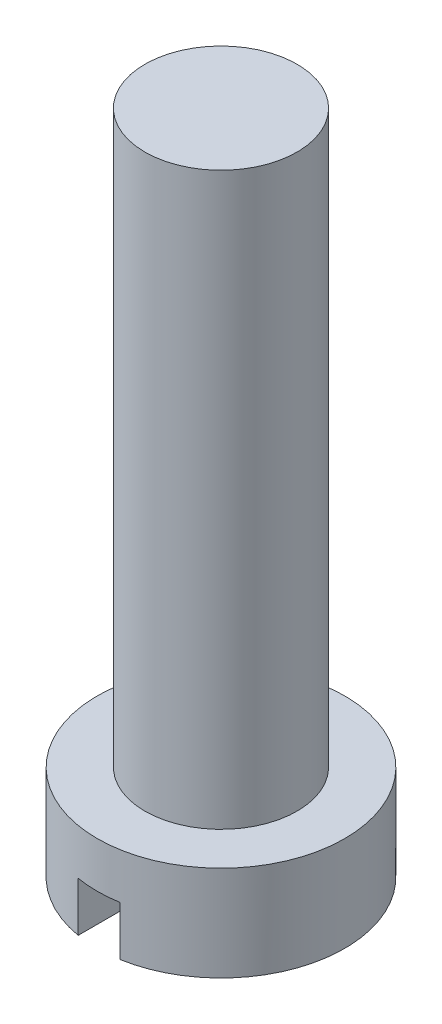
ISO-10303-21;
HEADER;
FILE_DESCRIPTION(('STEP AP214'),'2;1');
FILE_NAME('part.step','',(''),(''),'','','');
FILE_SCHEMA(('AUTOMOTIVE_DESIGN { 1 0 10303 214 1 1 1 1 }'));
ENDSEC;
DATA;
#1=APPLICATION_CONTEXT('core data for automotive mechanical design processes');
#2=APPLICATION_PROTOCOL_DEFINITION('international standard','automotive_design',2000,#1);
#3=PRODUCT_CONTEXT('',#1,'mechanical');
#4=PRODUCT('Part','Part','',(#3));
#5=PRODUCT_RELATED_PRODUCT_CATEGORY('part','',(#4));
#6=PRODUCT_DEFINITION_FORMATION('','',#4);
#7=PRODUCT_DEFINITION_CONTEXT('part definition',#1,'design');
#8=PRODUCT_DEFINITION('design','',#6,#7);
#9=PRODUCT_DEFINITION_SHAPE('','',#8);
#10=(LENGTH_UNIT() NAMED_UNIT(*) SI_UNIT(.MILLI.,.METRE.));
#11=(NAMED_UNIT(*) PLANE_ANGLE_UNIT() SI_UNIT($,.RADIAN.));
#12=(NAMED_UNIT(*) SI_UNIT($,.STERADIAN.) SOLID_ANGLE_UNIT());
#13=UNCERTAINTY_MEASURE_WITH_UNIT(LENGTH_MEASURE(1.E-05),#10,'distance_accuracy_value','');
#14=(GEOMETRIC_REPRESENTATION_CONTEXT(3) GLOBAL_UNCERTAINTY_ASSIGNED_CONTEXT((#13)) GLOBAL_UNIT_ASSIGNED_CONTEXT((#10,
#11,#12)) REPRESENTATION_CONTEXT('',''));
#15=CARTESIAN_POINT('',(0.,0.,0.));
#16=DIRECTION('',(0.,0.,1.));
#17=DIRECTION('',(1.,0.,0.));
#18=AXIS2_PLACEMENT_3D('',#15,#16,#17);
#19=CARTESIAN_POINT('',(0.,0.,0.));
#20=DIRECTION('',(0.,1.,0.));
#21=DIRECTION('',(0.,0.,1.));
#22=AXIS2_PLACEMENT_3D('',#19,#20,#21);
#23=PLANE('',#22);
#24=CARTESIAN_POINT('',(0.,0.,0.));
#25=DIRECTION('',(0.,1.,0.));
#26=DIRECTION('',(0.,0.,1.));
#27=AXIS2_PLACEMENT_3D('',#24,#25,#26);
#28=CIRCLE('',#27,6.5);
#29=CARTESIAN_POINT('',(-1.10000000000001,0.,-6.40624695121886));
#30=VERTEX_POINT('',#29);
#31=CARTESIAN_POINT('',(-1.1,0.,6.40624695121877));
#32=VERTEX_POINT('',#31);
#33=EDGE_CURVE('E92',#30,#32,#28,.T.);
#34=ORIENTED_EDGE('',*,*,#33,.F.);
#35=DIRECTION('',(0.,0.,1.));
#36=VECTOR('',#35,1.);
#37=CARTESIAN_POINT('',(-1.1,0.,0.));
#38=LINE('',#37,#36);
#39=EDGE_CURVE('E84',#30,#32,#38,.T.);
#40=ORIENTED_EDGE('',*,*,#39,.T.);
#41=EDGE_LOOP('',(#34,#40));
#42=FACE_BOUND('',#41,.T.);
#43=ADVANCED_FACE('F36',(#42),#23,.F.);
#44=CARTESIAN_POINT('',(0.,5.,0.));
#45=DIRECTION('',(0.,-1.,0.));
#46=DIRECTION('',(0.,0.,-1.));
#47=AXIS2_PLACEMENT_3D('',#44,#45,#46);
#48=CYLINDRICAL_SURFACE('',#47,6.5);
#49=CARTESIAN_POINT('',(0.,5.,0.));
#50=DIRECTION('',(0.,1.,0.));
#51=DIRECTION('',(0.,0.,1.));
#52=AXIS2_PLACEMENT_3D('',#49,#50,#51);
#53=CIRCLE('',#52,6.5);
#54=CARTESIAN_POINT('',(0.,5.,6.5));
#55=VERTEX_POINT('',#54);
#56=EDGE_CURVE('E85',#55,#55,#53,.T.);
#57=ORIENTED_EDGE('',*,*,#56,.F.);
#58=EDGE_LOOP('',(#57));
#59=FACE_BOUND('',#58,.T.);
#60=ORIENTED_EDGE('',*,*,#33,.T.);
#61=DIRECTION('',(0.,-1.,0.));
#62=VECTOR('',#61,1.);
#63=CARTESIAN_POINT('',(-1.1,5.,6.40624695121877));
#64=LINE('',#63,#62);
#65=CARTESIAN_POINT('',(-1.1,2.59999999999999,6.40624695121877));
#66=VERTEX_POINT('',#65);
#67=EDGE_CURVE('E59',#32,#66,#64,.F.);
#68=ORIENTED_EDGE('',*,*,#67,.T.);
#69=CARTESIAN_POINT('',(0.,2.59999999999999,0.));
#70=DIRECTION('',(0.,1.,0.));
#71=DIRECTION('',(0.,0.,1.));
#72=AXIS2_PLACEMENT_3D('',#69,#70,#71);
#73=CIRCLE('',#72,6.5);
#74=CARTESIAN_POINT('',(1.09999999999998,2.59999999999998,6.40624695121877));
#75=VERTEX_POINT('',#74);
#76=EDGE_CURVE('E11',#66,#75,#73,.T.);
#77=ORIENTED_EDGE('',*,*,#76,.T.);
#78=DIRECTION('',(0.,-1.,0.));
#79=VECTOR('',#78,1.);
#80=CARTESIAN_POINT('',(1.09999999999998,5.,6.40624695121876));
#81=LINE('',#80,#79);
#82=CARTESIAN_POINT('',(1.09999999999998,0.,6.40624695121878));
#83=VERTEX_POINT('',#82);
#84=EDGE_CURVE('E79',#75,#83,#81,.T.);
#85=ORIENTED_EDGE('',*,*,#84,.T.);
#86=CARTESIAN_POINT('',(1.09999999999999,0.,-6.40624695121879));
#87=VERTEX_POINT('',#86);
#88=EDGE_CURVE('E89',#83,#87,#28,.T.);
#89=ORIENTED_EDGE('',*,*,#88,.T.);
#90=DIRECTION('',(0.,-1.,0.));
#91=VECTOR('',#90,1.);
#92=CARTESIAN_POINT('',(1.10000000000002,5.,-6.40624695121879));
#93=LINE('',#92,#91);
#94=CARTESIAN_POINT('',(1.10000000000002,2.59999999999998,-6.40624695121879));
#95=VERTEX_POINT('',#94);
#96=EDGE_CURVE('E51',#87,#95,#93,.F.);
#97=ORIENTED_EDGE('',*,*,#96,.T.);
#98=CARTESIAN_POINT('',(-1.09999999999997,2.59999999999999,-6.40624695121886));
#99=VERTEX_POINT('',#98);
#100=EDGE_CURVE('E40',#95,#99,#73,.T.);
#101=ORIENTED_EDGE('',*,*,#100,.T.);
#102=DIRECTION('',(0.,-1.,0.));
#103=VECTOR('',#102,1.);
#104=CARTESIAN_POINT('',(-1.09999999999997,5.,-6.40624695121879));
#105=LINE('',#104,#103);
#106=EDGE_CURVE('E96',#99,#30,#105,.T.);
#107=ORIENTED_EDGE('',*,*,#106,.T.);
#108=EDGE_LOOP('',(#60,#68,#77,#85,#89,#97,#101,#107));
#109=FACE_BOUND('',#108,.T.);
#110=ADVANCED_FACE('F38',(#59,#109),#48,.T.);
#111=CARTESIAN_POINT('',(0.,5.,0.));
#112=DIRECTION('',(0.,1.,0.));
#113=DIRECTION('',(0.,0.,1.));
#114=AXIS2_PLACEMENT_3D('',#111,#112,#113);
#115=PLANE('',#114);
#116=CARTESIAN_POINT('',(0.,5.,0.));
#117=DIRECTION('',(0.,1.,0.));
#118=DIRECTION('',(0.,0.,1.));
#119=AXIS2_PLACEMENT_3D('',#116,#117,#118);
#120=CIRCLE('',#119,4.);
#121=CARTESIAN_POINT('',(0.,5.,4.));
#122=VERTEX_POINT('',#121);
#123=EDGE_CURVE('E111',#122,#122,#120,.T.);
#124=ORIENTED_EDGE('',*,*,#123,.F.);
#125=EDGE_LOOP('',(#124));
#126=FACE_BOUND('',#125,.T.);
#127=ORIENTED_EDGE('',*,*,#56,.T.);
#128=EDGE_LOOP('',(#127));
#129=FACE_BOUND('',#128,.T.);
#130=ADVANCED_FACE('F120',(#126,#129),#115,.T.);
#131=ORIENTED_EDGE('',*,*,#88,.F.);
#132=DIRECTION('',(0.,0.,-1.));
#133=VECTOR('',#132,1.);
#134=CARTESIAN_POINT('',(1.1,0.,0.));
#135=LINE('',#134,#133);
#136=EDGE_CURVE('E76',#83,#87,#135,.T.);
#137=ORIENTED_EDGE('',*,*,#136,.T.);
#138=EDGE_LOOP('',(#131,#137));
#139=FACE_BOUND('',#138,.T.);
#140=ADVANCED_FACE('F91',(#139),#23,.F.);
#141=CARTESIAN_POINT('',(-1.1,2.59999999999999,-6.95000000000007));
#142=DIRECTION('',(0.,1.,0.));
#143=DIRECTION('',(0.,0.,1.));
#144=AXIS2_PLACEMENT_3D('',#141,#142,#143);
#145=PLANE('',#144);
#146=DIRECTION('',(0.,0.,1.));
#147=VECTOR('',#146,1.);
#148=CARTESIAN_POINT('',(1.1,2.59999999999998,-6.95));
#149=LINE('',#148,#147);
#150=EDGE_CURVE('E105',#95,#75,#149,.T.);
#151=ORIENTED_EDGE('',*,*,#150,.T.);
#152=ORIENTED_EDGE('',*,*,#76,.F.);
#153=DIRECTION('',(0.,0.,1.));
#154=VECTOR('',#153,1.);
#155=CARTESIAN_POINT('',(-1.1,2.59999999999999,-6.95000000000007));
#156=LINE('',#155,#154);
#157=EDGE_CURVE('E106',#99,#66,#156,.T.);
#158=ORIENTED_EDGE('',*,*,#157,.F.);
#159=ORIENTED_EDGE('',*,*,#100,.F.);
#160=EDGE_LOOP('',(#151,#152,#158,#159));
#161=FACE_BOUND('',#160,.T.);
#162=ADVANCED_FACE('F104',(#161),#145,.F.);
#163=CARTESIAN_POINT('',(-1.1,2.59999999999999,-6.95000000000007));
#164=DIRECTION('',(-1.,0.,0.));
#165=DIRECTION('',(0.,-1.,0.));
#166=AXIS2_PLACEMENT_3D('',#163,#164,#165);
#167=PLANE('',#166);
#168=ORIENTED_EDGE('',*,*,#157,.T.);
#169=ORIENTED_EDGE('',*,*,#67,.F.);
#170=ORIENTED_EDGE('',*,*,#39,.F.);
#171=ORIENTED_EDGE('',*,*,#106,.F.);
#172=EDGE_LOOP('',(#168,#169,#170,#171));
#173=FACE_BOUND('',#172,.T.);
#174=ADVANCED_FACE('F128',(#173),#167,.F.);
#175=CARTESIAN_POINT('',(1.1,2.59999999999998,-6.95));
#176=DIRECTION('',(1.,0.,0.));
#177=DIRECTION('',(0.,1.,0.));
#178=AXIS2_PLACEMENT_3D('',#175,#176,#177);
#179=PLANE('',#178);
#180=ORIENTED_EDGE('',*,*,#150,.F.);
#181=ORIENTED_EDGE('',*,*,#96,.F.);
#182=ORIENTED_EDGE('',*,*,#136,.F.);
#183=ORIENTED_EDGE('',*,*,#84,.F.);
#184=EDGE_LOOP('',(#180,#181,#182,#183));
#185=FACE_BOUND('',#184,.T.);
#186=ADVANCED_FACE('F78',(#185),#179,.F.);
#187=CARTESIAN_POINT('',(0.,35.0000000000001,0.));
#188=DIRECTION('',(0.,-1.,0.));
#189=DIRECTION('',(0.,0.,-1.));
#190=AXIS2_PLACEMENT_3D('',#187,#188,#189);
#191=CYLINDRICAL_SURFACE('',#190,4.);
#192=CARTESIAN_POINT('',(0.,35.0000000000001,0.));
#193=DIRECTION('',(0.,1.,0.));
#194=DIRECTION('',(0.,0.,1.));
#195=AXIS2_PLACEMENT_3D('',#192,#193,#194);
#196=CIRCLE('',#195,4.);
#197=CARTESIAN_POINT('',(0.,35.0000000000001,3.99999999999994));
#198=VERTEX_POINT('',#197);
#199=EDGE_CURVE('E107',#198,#198,#196,.T.);
#200=ORIENTED_EDGE('',*,*,#199,.F.);
#201=EDGE_LOOP('',(#200));
#202=FACE_BOUND('',#201,.T.);
#203=ORIENTED_EDGE('',*,*,#123,.T.);
#204=EDGE_LOOP('',(#203));
#205=FACE_BOUND('',#204,.T.);
#206=ADVANCED_FACE('F139',(#202,#205),#191,.T.);
#207=CARTESIAN_POINT('',(0.,35.0000000000001,0.));
#208=DIRECTION('',(0.,1.,0.));
#209=DIRECTION('',(0.,0.,1.));
#210=AXIS2_PLACEMENT_3D('',#207,#208,#209);
#211=PLANE('',#210);
#212=ORIENTED_EDGE('',*,*,#199,.T.);
#213=EDGE_LOOP('',(#212));
#214=FACE_BOUND('',#213,.T.);
#215=ADVANCED_FACE('F143',(#214),#211,.T.);
#216=CLOSED_SHELL('',(#43,#110,#130,#140,#162,#174,#186,#206,#215));
#217=MANIFOLD_SOLID_BREP('B2',#216);
#218=ADVANCED_BREP_SHAPE_REPRESENTATION('',(#18,#217),#14);
#219=SHAPE_DEFINITION_REPRESENTATION(#9,#218);
ENDSEC;
END-ISO-10303-21;
